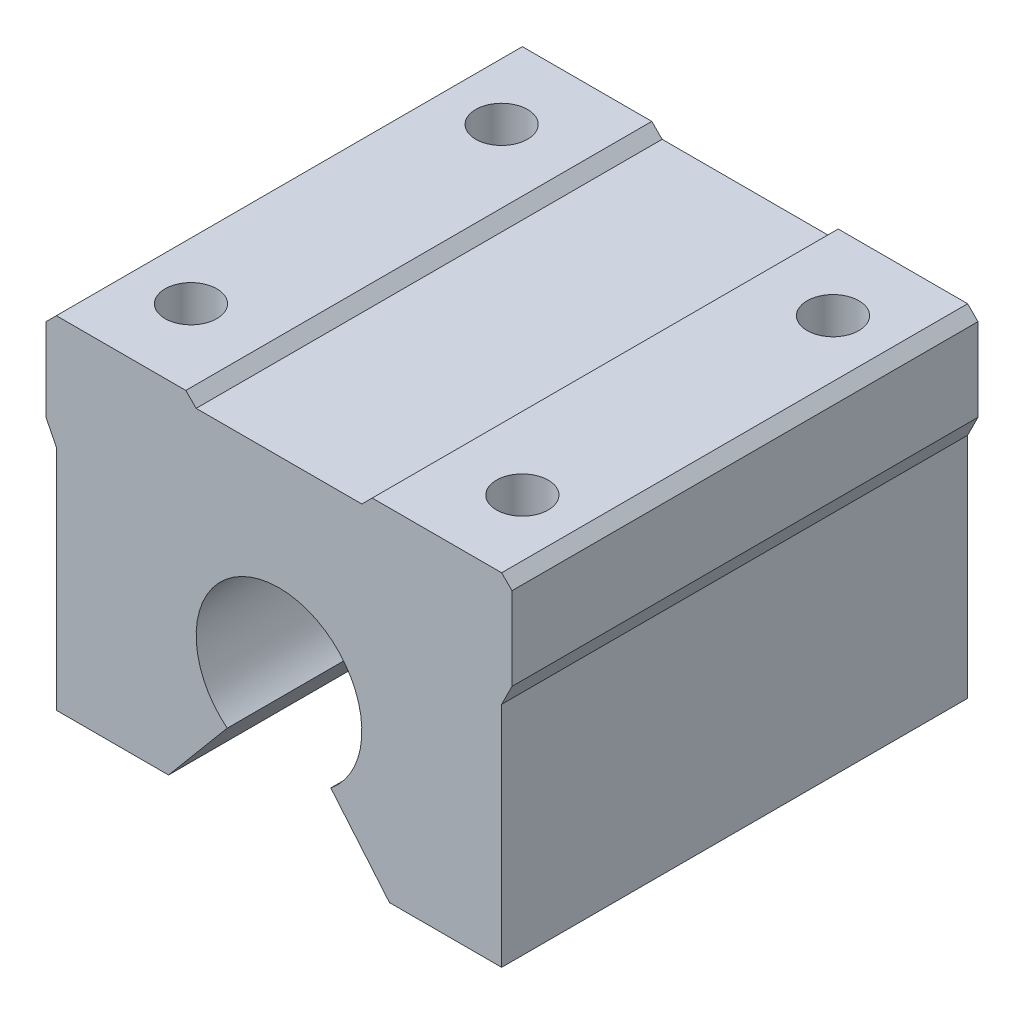
ISO-10303-21;
HEADER;
FILE_DESCRIPTION(('STEP AP214'),'2;1');
FILE_NAME('part.step','',(''),(''),'','','');
FILE_SCHEMA(('AUTOMOTIVE_DESIGN { 1 0 10303 214 1 1 1 1 }'));
ENDSEC;
DATA;
#1=APPLICATION_CONTEXT('core data for automotive mechanical design processes');
#2=APPLICATION_PROTOCOL_DEFINITION('international standard','automotive_design',2000,#1);
#3=PRODUCT_CONTEXT('',#1,'mechanical');
#4=PRODUCT('Part','Part','',(#3));
#5=PRODUCT_RELATED_PRODUCT_CATEGORY('part','',(#4));
#6=PRODUCT_DEFINITION_FORMATION('','',#4);
#7=PRODUCT_DEFINITION_CONTEXT('part definition',#1,'design');
#8=PRODUCT_DEFINITION('design','',#6,#7);
#9=PRODUCT_DEFINITION_SHAPE('','',#8);
#10=(LENGTH_UNIT() NAMED_UNIT(*) SI_UNIT(.MILLI.,.METRE.));
#11=(NAMED_UNIT(*) PLANE_ANGLE_UNIT() SI_UNIT($,.RADIAN.));
#12=(NAMED_UNIT(*) SI_UNIT($,.STERADIAN.) SOLID_ANGLE_UNIT());
#13=UNCERTAINTY_MEASURE_WITH_UNIT(LENGTH_MEASURE(1.E-05),#10,'distance_accuracy_value','');
#14=(GEOMETRIC_REPRESENTATION_CONTEXT(3) GLOBAL_UNCERTAINTY_ASSIGNED_CONTEXT((#13)) GLOBAL_UNIT_ASSIGNED_CONTEXT((#10,
#11,#12)) REPRESENTATION_CONTEXT('',''));
#15=CARTESIAN_POINT('',(0.,0.,0.));
#16=DIRECTION('',(0.,0.,1.));
#17=DIRECTION('',(1.,0.,0.));
#18=AXIS2_PLACEMENT_3D('',#15,#16,#17);
#19=CARTESIAN_POINT('',(0.,13.,45.));
#20=DIRECTION('',(0.,0.,-1.));
#21=DIRECTION('',(-1.,0.,0.));
#22=AXIS2_PLACEMENT_3D('',#19,#20,#21);
#23=CYLINDRICAL_SURFACE('',#22,8.);
#24=CARTESIAN_POINT('',(0.,13.,0.));
#25=DIRECTION('',(0.,0.,-1.));
#26=DIRECTION('',(1.,0.,0.));
#27=AXIS2_PLACEMENT_3D('',#24,#25,#26);
#28=CIRCLE('',#27,8.);
#29=CARTESIAN_POINT('',(-5.,6.7550020016016,0.));
#30=VERTEX_POINT('',#29);
#31=CARTESIAN_POINT('',(5.,6.7550020016016,0.));
#32=VERTEX_POINT('',#31);
#33=EDGE_CURVE('E193',#30,#32,#28,.T.);
#34=ORIENTED_EDGE('',*,*,#33,.T.);
#35=DIRECTION('',(0.,0.,-1.));
#36=VECTOR('',#35,1.);
#37=CARTESIAN_POINT('',(5.,6.7550020016016,45.));
#38=LINE('',#37,#36);
#39=CARTESIAN_POINT('',(5.,6.7550020016016,45.));
#40=VERTEX_POINT('',#39);
#41=EDGE_CURVE('E11',#40,#32,#38,.T.);
#42=ORIENTED_EDGE('',*,*,#41,.F.);
#43=CARTESIAN_POINT('',(0.,13.,45.));
#44=DIRECTION('',(0.,0.,-1.));
#45=DIRECTION('',(1.,0.,0.));
#46=AXIS2_PLACEMENT_3D('',#43,#44,#45);
#47=CIRCLE('',#46,8.);
#48=CARTESIAN_POINT('',(-5.,6.7550020016016,45.));
#49=VERTEX_POINT('',#48);
#50=EDGE_CURVE('E228',#49,#40,#47,.T.);
#51=ORIENTED_EDGE('',*,*,#50,.F.);
#52=DIRECTION('',(0.,0.,-1.));
#53=VECTOR('',#52,1.);
#54=CARTESIAN_POINT('',(-5.,6.7550020016016,45.));
#55=LINE('',#54,#53);
#56=EDGE_CURVE('E189',#49,#30,#55,.T.);
#57=ORIENTED_EDGE('',*,*,#56,.T.);
#58=EDGE_LOOP('',(#34,#42,#51,#57));
#59=FACE_BOUND('',#58,.T.);
#60=ADVANCED_FACE('F34',(#59),#23,.F.);
#61=CARTESIAN_POINT('',(10.6681196881457,0.,45.));
#62=DIRECTION('',(0.766044443118977,0.642787609686541,0.));
#63=DIRECTION('',(-0.642787609686541,0.766044443118977,0.));
#64=AXIS2_PLACEMENT_3D('',#61,#62,#63);
#65=PLANE('',#64);
#66=DIRECTION('',(0.642787609686541,-0.766044443118977,0.));
#67=VECTOR('',#66,1.);
#68=CARTESIAN_POINT('',(10.6681196881457,0.,0.));
#69=LINE('',#68,#67);
#70=CARTESIAN_POINT('',(10.6681196881457,0.,0.));
#71=VERTEX_POINT('',#70);
#72=EDGE_CURVE('E196',#32,#71,#69,.T.);
#73=ORIENTED_EDGE('',*,*,#72,.T.);
#74=DIRECTION('',(0.,0.,-1.));
#75=VECTOR('',#74,1.);
#76=CARTESIAN_POINT('',(10.6681196881457,0.,45.));
#77=LINE('',#76,#75);
#78=CARTESIAN_POINT('',(10.6681196881457,0.,45.));
#79=VERTEX_POINT('',#78);
#80=EDGE_CURVE('E42',#79,#71,#77,.T.);
#81=ORIENTED_EDGE('',*,*,#80,.F.);
#82=DIRECTION('',(0.642787609686541,-0.766044443118977,0.));
#83=VECTOR('',#82,1.);
#84=CARTESIAN_POINT('',(10.6681196881457,0.,45.));
#85=LINE('',#84,#83);
#86=EDGE_CURVE('E124',#40,#79,#85,.T.);
#87=ORIENTED_EDGE('',*,*,#86,.F.);
#88=ORIENTED_EDGE('',*,*,#41,.T.);
#89=EDGE_LOOP('',(#73,#81,#87,#88));
#90=FACE_BOUND('',#89,.T.);
#91=ADVANCED_FACE('F336',(#90),#65,.F.);
#92=CARTESIAN_POINT('',(21.5,0.,45.));
#93=DIRECTION('',(0.,1.,0.));
#94=DIRECTION('',(-1.,0.,0.));
#95=AXIS2_PLACEMENT_3D('',#92,#93,#94);
#96=PLANE('',#95);
#97=DIRECTION('',(1.,0.,0.));
#98=VECTOR('',#97,1.);
#99=CARTESIAN_POINT('',(21.5,0.,0.));
#100=LINE('',#99,#98);
#101=CARTESIAN_POINT('',(21.5,0.,0.));
#102=VERTEX_POINT('',#101);
#103=EDGE_CURVE('E199',#71,#102,#100,.T.);
#104=ORIENTED_EDGE('',*,*,#103,.T.);
#105=DIRECTION('',(0.,0.,-1.));
#106=VECTOR('',#105,1.);
#107=CARTESIAN_POINT('',(21.5,0.,45.));
#108=LINE('',#107,#106);
#109=CARTESIAN_POINT('',(21.5,0.,45.));
#110=VERTEX_POINT('',#109);
#111=EDGE_CURVE('E265',#110,#102,#108,.T.);
#112=ORIENTED_EDGE('',*,*,#111,.F.);
#113=DIRECTION('',(1.,0.,0.));
#114=VECTOR('',#113,1.);
#115=CARTESIAN_POINT('',(21.5,0.,45.));
#116=LINE('',#115,#114);
#117=EDGE_CURVE('E273',#79,#110,#116,.T.);
#118=ORIENTED_EDGE('',*,*,#117,.F.);
#119=ORIENTED_EDGE('',*,*,#80,.T.);
#120=EDGE_LOOP('',(#104,#112,#118,#119));
#121=FACE_BOUND('',#120,.T.);
#122=ADVANCED_FACE('F271',(#121),#96,.F.);
#123=CARTESIAN_POINT('',(21.5,22.,45.));
#124=DIRECTION('',(-1.,0.,0.));
#125=DIRECTION('',(0.,-1.,0.));
#126=AXIS2_PLACEMENT_3D('',#123,#124,#125);
#127=PLANE('',#126);
#128=DIRECTION('',(0.,1.,0.));
#129=VECTOR('',#128,1.);
#130=CARTESIAN_POINT('',(21.5,22.,0.));
#131=LINE('',#130,#129);
#132=CARTESIAN_POINT('',(21.5,22.,0.));
#133=VERTEX_POINT('',#132);
#134=EDGE_CURVE('E201',#102,#133,#131,.T.);
#135=ORIENTED_EDGE('',*,*,#134,.T.);
#136=DIRECTION('',(0.,0.,-1.));
#137=VECTOR('',#136,1.);
#138=CARTESIAN_POINT('',(21.5,22.,45.));
#139=LINE('',#138,#137);
#140=CARTESIAN_POINT('',(21.5,22.,45.));
#141=VERTEX_POINT('',#140);
#142=EDGE_CURVE('E262',#141,#133,#139,.T.);
#143=ORIENTED_EDGE('',*,*,#142,.F.);
#144=DIRECTION('',(0.,1.,0.));
#145=VECTOR('',#144,1.);
#146=CARTESIAN_POINT('',(21.5,22.,45.));
#147=LINE('',#146,#145);
#148=EDGE_CURVE('E291',#110,#141,#147,.T.);
#149=ORIENTED_EDGE('',*,*,#148,.F.);
#150=ORIENTED_EDGE('',*,*,#111,.T.);
#151=EDGE_LOOP('',(#135,#143,#149,#150));
#152=FACE_BOUND('',#151,.T.);
#153=ADVANCED_FACE('F282',(#152),#127,.F.);
#154=CARTESIAN_POINT('',(22.5,24.,45.));
#155=DIRECTION('',(-0.894427190999916,0.447213595499958,0.));
#156=DIRECTION('',(-0.447213595499958,-0.894427190999916,0.));
#157=AXIS2_PLACEMENT_3D('',#154,#155,#156);
#158=PLANE('',#157);
#159=DIRECTION('',(0.447213595499958,0.894427190999916,0.));
#160=VECTOR('',#159,1.);
#161=CARTESIAN_POINT('',(22.5,24.,0.));
#162=LINE('',#161,#160);
#163=CARTESIAN_POINT('',(22.5,24.,0.));
#164=VERTEX_POINT('',#163);
#165=EDGE_CURVE('E203',#133,#164,#162,.T.);
#166=ORIENTED_EDGE('',*,*,#165,.T.);
#167=DIRECTION('',(0.,0.,-1.));
#168=VECTOR('',#167,1.);
#169=CARTESIAN_POINT('',(22.5,24.,45.));
#170=LINE('',#169,#168);
#171=CARTESIAN_POINT('',(22.5,24.,45.));
#172=VERTEX_POINT('',#171);
#173=EDGE_CURVE('E259',#172,#164,#170,.T.);
#174=ORIENTED_EDGE('',*,*,#173,.F.);
#175=DIRECTION('',(0.447213595499958,0.894427190999916,0.));
#176=VECTOR('',#175,1.);
#177=CARTESIAN_POINT('',(22.5,24.,45.));
#178=LINE('',#177,#176);
#179=EDGE_CURVE('E288',#141,#172,#178,.T.);
#180=ORIENTED_EDGE('',*,*,#179,.F.);
#181=ORIENTED_EDGE('',*,*,#142,.T.);
#182=EDGE_LOOP('',(#166,#174,#180,#181));
#183=FACE_BOUND('',#182,.T.);
#184=ADVANCED_FACE('F286',(#183),#158,.F.);
#185=CARTESIAN_POINT('',(22.5,32.,45.));
#186=DIRECTION('',(-1.,0.,0.));
#187=DIRECTION('',(0.,0.,1.));
#188=AXIS2_PLACEMENT_3D('',#185,#186,#187);
#189=PLANE('',#188);
#190=DIRECTION('',(0.,1.,0.));
#191=VECTOR('',#190,1.);
#192=CARTESIAN_POINT('',(22.5,32.,0.));
#193=LINE('',#192,#191);
#194=CARTESIAN_POINT('',(22.5,32.,0.));
#195=VERTEX_POINT('',#194);
#196=EDGE_CURVE('E205',#164,#195,#193,.T.);
#197=ORIENTED_EDGE('',*,*,#196,.T.);
#198=DIRECTION('',(0.,0.,-1.));
#199=VECTOR('',#198,1.);
#200=CARTESIAN_POINT('',(22.5,32.,45.));
#201=LINE('',#200,#199);
#202=CARTESIAN_POINT('',(22.5,32.,45.));
#203=VERTEX_POINT('',#202);
#204=EDGE_CURVE('E256',#203,#195,#201,.T.);
#205=ORIENTED_EDGE('',*,*,#204,.F.);
#206=DIRECTION('',(0.,1.,0.));
#207=VECTOR('',#206,1.);
#208=CARTESIAN_POINT('',(22.5,32.,45.));
#209=LINE('',#208,#207);
#210=EDGE_CURVE('E290',#172,#203,#209,.T.);
#211=ORIENTED_EDGE('',*,*,#210,.F.);
#212=ORIENTED_EDGE('',*,*,#173,.T.);
#213=EDGE_LOOP('',(#197,#205,#211,#212));
#214=FACE_BOUND('',#213,.T.);
#215=ADVANCED_FACE('F349',(#214),#189,.F.);
#216=CARTESIAN_POINT('',(21.5,33.,45.));
#217=DIRECTION('',(-0.707106781186547,-0.707106781186547,0.));
#218=DIRECTION('',(0.707106781186548,-0.707106781186548,0.));
#219=AXIS2_PLACEMENT_3D('',#216,#217,#218);
#220=PLANE('',#219);
#221=DIRECTION('',(-0.707106781186547,0.707106781186547,0.));
#222=VECTOR('',#221,1.);
#223=CARTESIAN_POINT('',(21.5,33.,0.));
#224=LINE('',#223,#222);
#225=CARTESIAN_POINT('',(21.5,33.,0.));
#226=VERTEX_POINT('',#225);
#227=EDGE_CURVE('E207',#195,#226,#224,.T.);
#228=ORIENTED_EDGE('',*,*,#227,.T.);
#229=DIRECTION('',(0.,0.,-1.));
#230=VECTOR('',#229,1.);
#231=CARTESIAN_POINT('',(21.5,33.,45.));
#232=LINE('',#231,#230);
#233=CARTESIAN_POINT('',(21.5,33.,45.));
#234=VERTEX_POINT('',#233);
#235=EDGE_CURVE('E253',#234,#226,#232,.T.);
#236=ORIENTED_EDGE('',*,*,#235,.F.);
#237=DIRECTION('',(-0.707106781186547,0.707106781186547,0.));
#238=VECTOR('',#237,1.);
#239=CARTESIAN_POINT('',(21.5,33.,45.));
#240=LINE('',#239,#238);
#241=EDGE_CURVE('E293',#203,#234,#240,.T.);
#242=ORIENTED_EDGE('',*,*,#241,.F.);
#243=ORIENTED_EDGE('',*,*,#204,.T.);
#244=EDGE_LOOP('',(#228,#236,#242,#243));
#245=FACE_BOUND('',#244,.T.);
#246=ADVANCED_FACE('F352',(#245),#220,.F.);
#247=CARTESIAN_POINT('',(9.,33.,45.));
#248=DIRECTION('',(0.,-1.,0.));
#249=DIRECTION('',(0.,0.,-1.));
#250=AXIS2_PLACEMENT_3D('',#247,#248,#249);
#251=PLANE('',#250);
#252=CARTESIAN_POINT('',(16.,33.,37.5));
#253=DIRECTION('',(0.,1.,0.));
#254=DIRECTION('',(0.,0.,1.));
#255=AXIS2_PLACEMENT_3D('',#252,#253,#254);
#256=CIRCLE('',#255,2.5);
#257=CARTESIAN_POINT('',(16.,33.,40.));
#258=VERTEX_POINT('',#257);
#259=EDGE_CURVE('E528',#258,#258,#256,.T.);
#260=ORIENTED_EDGE('',*,*,#259,.F.);
#261=EDGE_LOOP('',(#260));
#262=FACE_BOUND('',#261,.T.);
#263=CARTESIAN_POINT('',(16.,33.,7.5));
#264=DIRECTION('',(0.,1.,0.));
#265=DIRECTION('',(0.,0.,1.));
#266=AXIS2_PLACEMENT_3D('',#263,#264,#265);
#267=CIRCLE('',#266,2.5);
#268=CARTESIAN_POINT('',(16.,33.,10.));
#269=VERTEX_POINT('',#268);
#270=EDGE_CURVE('E531',#269,#269,#267,.T.);
#271=ORIENTED_EDGE('',*,*,#270,.F.);
#272=EDGE_LOOP('',(#271));
#273=FACE_BOUND('',#272,.T.);
#274=DIRECTION('',(-1.,0.,0.));
#275=VECTOR('',#274,1.);
#276=CARTESIAN_POINT('',(9.,33.,0.));
#277=LINE('',#276,#275);
#278=CARTESIAN_POINT('',(9.,33.,0.));
#279=VERTEX_POINT('',#278);
#280=EDGE_CURVE('E209',#226,#279,#277,.T.);
#281=ORIENTED_EDGE('',*,*,#280,.T.);
#282=DIRECTION('',(0.,0.,-1.));
#283=VECTOR('',#282,1.);
#284=CARTESIAN_POINT('',(9.,33.,45.));
#285=LINE('',#284,#283);
#286=CARTESIAN_POINT('',(9.,33.,45.));
#287=VERTEX_POINT('',#286);
#288=EDGE_CURVE('E250',#287,#279,#285,.T.);
#289=ORIENTED_EDGE('',*,*,#288,.F.);
#290=DIRECTION('',(-1.,0.,0.));
#291=VECTOR('',#290,1.);
#292=CARTESIAN_POINT('',(9.,33.,45.));
#293=LINE('',#292,#291);
#294=EDGE_CURVE('E299',#234,#287,#293,.T.);
#295=ORIENTED_EDGE('',*,*,#294,.F.);
#296=ORIENTED_EDGE('',*,*,#235,.T.);
#297=EDGE_LOOP('',(#281,#289,#295,#296));
#298=FACE_BOUND('',#297,.T.);
#299=ADVANCED_FACE('F356',(#262,#273,#298),#251,.F.);
#300=CARTESIAN_POINT('',(8.,32.,45.));
#301=DIRECTION('',(0.707106781186547,-0.707106781186547,0.));
#302=DIRECTION('',(0.707106781186548,0.707106781186548,0.));
#303=AXIS2_PLACEMENT_3D('',#300,#301,#302);
#304=PLANE('',#303);
#305=DIRECTION('',(-0.707106781186547,-0.707106781186547,0.));
#306=VECTOR('',#305,1.);
#307=CARTESIAN_POINT('',(8.,32.,0.));
#308=LINE('',#307,#306);
#309=CARTESIAN_POINT('',(8.,32.,0.));
#310=VERTEX_POINT('',#309);
#311=EDGE_CURVE('E211',#279,#310,#308,.T.);
#312=ORIENTED_EDGE('',*,*,#311,.T.);
#313=DIRECTION('',(0.,0.,-1.));
#314=VECTOR('',#313,1.);
#315=CARTESIAN_POINT('',(8.,32.,45.));
#316=LINE('',#315,#314);
#317=CARTESIAN_POINT('',(8.,32.,45.));
#318=VERTEX_POINT('',#317);
#319=EDGE_CURVE('E247',#318,#310,#316,.T.);
#320=ORIENTED_EDGE('',*,*,#319,.F.);
#321=DIRECTION('',(-0.707106781186547,-0.707106781186547,0.));
#322=VECTOR('',#321,1.);
#323=CARTESIAN_POINT('',(8.,32.,45.));
#324=LINE('',#323,#322);
#325=EDGE_CURVE('E301',#287,#318,#324,.T.);
#326=ORIENTED_EDGE('',*,*,#325,.F.);
#327=ORIENTED_EDGE('',*,*,#288,.T.);
#328=EDGE_LOOP('',(#312,#320,#326,#327));
#329=FACE_BOUND('',#328,.T.);
#330=ADVANCED_FACE('F360',(#329),#304,.F.);
#331=CARTESIAN_POINT('',(8.,32.,45.));
#332=DIRECTION('',(0.,-1.,0.));
#333=DIRECTION('',(0.,0.,-1.));
#334=AXIS2_PLACEMENT_3D('',#331,#332,#333);
#335=PLANE('',#334);
#336=DIRECTION('',(-1.,0.,0.));
#337=VECTOR('',#336,1.);
#338=CARTESIAN_POINT('',(8.,32.,0.));
#339=LINE('',#338,#337);
#340=CARTESIAN_POINT('',(-8.,32.,0.));
#341=VERTEX_POINT('',#340);
#342=EDGE_CURVE('E213',#310,#341,#339,.T.);
#343=ORIENTED_EDGE('',*,*,#342,.T.);
#344=DIRECTION('',(0.,0.,-1.));
#345=VECTOR('',#344,1.);
#346=CARTESIAN_POINT('',(-8.,32.,45.));
#347=LINE('',#346,#345);
#348=CARTESIAN_POINT('',(-8.,32.,45.));
#349=VERTEX_POINT('',#348);
#350=EDGE_CURVE('E244',#349,#341,#347,.T.);
#351=ORIENTED_EDGE('',*,*,#350,.F.);
#352=DIRECTION('',(-1.,0.,0.));
#353=VECTOR('',#352,1.);
#354=CARTESIAN_POINT('',(8.,32.,45.));
#355=LINE('',#354,#353);
#356=EDGE_CURVE('E303',#318,#349,#355,.T.);
#357=ORIENTED_EDGE('',*,*,#356,.F.);
#358=ORIENTED_EDGE('',*,*,#319,.T.);
#359=EDGE_LOOP('',(#343,#351,#357,#358));
#360=FACE_BOUND('',#359,.T.);
#361=ADVANCED_FACE('F364',(#360),#335,.F.);
#362=CARTESIAN_POINT('',(-8.,32.,45.));
#363=DIRECTION('',(-0.707106781186547,-0.707106781186547,0.));
#364=DIRECTION('',(0.707106781186548,-0.707106781186548,0.));
#365=AXIS2_PLACEMENT_3D('',#362,#363,#364);
#366=PLANE('',#365);
#367=DIRECTION('',(-0.707106781186547,0.707106781186547,0.));
#368=VECTOR('',#367,1.);
#369=CARTESIAN_POINT('',(-8.,32.,0.));
#370=LINE('',#369,#368);
#371=CARTESIAN_POINT('',(-9.,33.,0.));
#372=VERTEX_POINT('',#371);
#373=EDGE_CURVE('E215',#341,#372,#370,.T.);
#374=ORIENTED_EDGE('',*,*,#373,.T.);
#375=DIRECTION('',(0.,0.,-1.));
#376=VECTOR('',#375,1.);
#377=CARTESIAN_POINT('',(-9.,33.,45.));
#378=LINE('',#377,#376);
#379=CARTESIAN_POINT('',(-9.,33.,45.));
#380=VERTEX_POINT('',#379);
#381=EDGE_CURVE('E241',#380,#372,#378,.T.);
#382=ORIENTED_EDGE('',*,*,#381,.F.);
#383=DIRECTION('',(-0.707106781186547,0.707106781186547,0.));
#384=VECTOR('',#383,1.);
#385=CARTESIAN_POINT('',(-8.,32.,45.));
#386=LINE('',#385,#384);
#387=EDGE_CURVE('E305',#349,#380,#386,.T.);
#388=ORIENTED_EDGE('',*,*,#387,.F.);
#389=ORIENTED_EDGE('',*,*,#350,.T.);
#390=EDGE_LOOP('',(#374,#382,#388,#389));
#391=FACE_BOUND('',#390,.T.);
#392=ADVANCED_FACE('F368',(#391),#366,.F.);
#393=CARTESIAN_POINT('',(-9.,33.,45.));
#394=DIRECTION('',(0.,-1.,0.));
#395=DIRECTION('',(0.,0.,-1.));
#396=AXIS2_PLACEMENT_3D('',#393,#394,#395);
#397=PLANE('',#396);
#398=CARTESIAN_POINT('',(-16.,33.,7.5));
#399=DIRECTION('',(0.,1.,0.));
#400=DIRECTION('',(0.,0.,1.));
#401=AXIS2_PLACEMENT_3D('',#398,#399,#400);
#402=CIRCLE('',#401,2.5);
#403=CARTESIAN_POINT('',(-16.,33.,10.));
#404=VERTEX_POINT('',#403);
#405=EDGE_CURVE('E534',#404,#404,#402,.T.);
#406=ORIENTED_EDGE('',*,*,#405,.F.);
#407=EDGE_LOOP('',(#406));
#408=FACE_BOUND('',#407,.T.);
#409=CARTESIAN_POINT('',(-16.,33.,37.5));
#410=DIRECTION('',(0.,1.,0.));
#411=DIRECTION('',(0.,0.,1.));
#412=AXIS2_PLACEMENT_3D('',#409,#410,#411);
#413=CIRCLE('',#412,2.5);
#414=CARTESIAN_POINT('',(-16.,33.,40.));
#415=VERTEX_POINT('',#414);
#416=EDGE_CURVE('E197',#415,#415,#413,.T.);
#417=ORIENTED_EDGE('',*,*,#416,.F.);
#418=EDGE_LOOP('',(#417));
#419=FACE_BOUND('',#418,.T.);
#420=DIRECTION('',(-1.,0.,0.));
#421=VECTOR('',#420,1.);
#422=CARTESIAN_POINT('',(-9.,33.,0.));
#423=LINE('',#422,#421);
#424=CARTESIAN_POINT('',(-21.5,33.,0.));
#425=VERTEX_POINT('',#424);
#426=EDGE_CURVE('E217',#372,#425,#423,.T.);
#427=ORIENTED_EDGE('',*,*,#426,.T.);
#428=DIRECTION('',(0.,0.,-1.));
#429=VECTOR('',#428,1.);
#430=CARTESIAN_POINT('',(-21.5,33.,45.));
#431=LINE('',#430,#429);
#432=CARTESIAN_POINT('',(-21.5,33.,45.));
#433=VERTEX_POINT('',#432);
#434=EDGE_CURVE('E238',#433,#425,#431,.T.);
#435=ORIENTED_EDGE('',*,*,#434,.F.);
#436=DIRECTION('',(-1.,0.,0.));
#437=VECTOR('',#436,1.);
#438=CARTESIAN_POINT('',(-9.,33.,45.));
#439=LINE('',#438,#437);
#440=EDGE_CURVE('E307',#380,#433,#439,.T.);
#441=ORIENTED_EDGE('',*,*,#440,.F.);
#442=ORIENTED_EDGE('',*,*,#381,.T.);
#443=EDGE_LOOP('',(#427,#435,#441,#442));
#444=FACE_BOUND('',#443,.T.);
#445=ADVANCED_FACE('F372',(#408,#419,#444),#397,.F.);
#446=CARTESIAN_POINT('',(-21.5,33.,45.));
#447=DIRECTION('',(0.707106781186547,-0.707106781186547,0.));
#448=DIRECTION('',(0.707106781186548,0.707106781186548,0.));
#449=AXIS2_PLACEMENT_3D('',#446,#447,#448);
#450=PLANE('',#449);
#451=DIRECTION('',(-0.707106781186547,-0.707106781186547,0.));
#452=VECTOR('',#451,1.);
#453=CARTESIAN_POINT('',(-21.5,33.,0.));
#454=LINE('',#453,#452);
#455=CARTESIAN_POINT('',(-22.5,32.,0.));
#456=VERTEX_POINT('',#455);
#457=EDGE_CURVE('E219',#425,#456,#454,.T.);
#458=ORIENTED_EDGE('',*,*,#457,.T.);
#459=DIRECTION('',(0.,0.,-1.));
#460=VECTOR('',#459,1.);
#461=CARTESIAN_POINT('',(-22.5,32.,45.));
#462=LINE('',#461,#460);
#463=CARTESIAN_POINT('',(-22.5,32.,45.));
#464=VERTEX_POINT('',#463);
#465=EDGE_CURVE('E235',#464,#456,#462,.T.);
#466=ORIENTED_EDGE('',*,*,#465,.F.);
#467=DIRECTION('',(-0.707106781186547,-0.707106781186547,0.));
#468=VECTOR('',#467,1.);
#469=CARTESIAN_POINT('',(-21.5,33.,45.));
#470=LINE('',#469,#468);
#471=EDGE_CURVE('E309',#433,#464,#470,.T.);
#472=ORIENTED_EDGE('',*,*,#471,.F.);
#473=ORIENTED_EDGE('',*,*,#434,.T.);
#474=EDGE_LOOP('',(#458,#466,#472,#473));
#475=FACE_BOUND('',#474,.T.);
#476=ADVANCED_FACE('F376',(#475),#450,.F.);
#477=CARTESIAN_POINT('',(-22.5,32.,45.));
#478=DIRECTION('',(1.,0.,0.));
#479=DIRECTION('',(0.,0.,-1.));
#480=AXIS2_PLACEMENT_3D('',#477,#478,#479);
#481=PLANE('',#480);
#482=DIRECTION('',(0.,-1.,0.));
#483=VECTOR('',#482,1.);
#484=CARTESIAN_POINT('',(-22.5,32.,0.));
#485=LINE('',#484,#483);
#486=CARTESIAN_POINT('',(-22.5,24.,0.));
#487=VERTEX_POINT('',#486);
#488=EDGE_CURVE('E221',#456,#487,#485,.T.);
#489=ORIENTED_EDGE('',*,*,#488,.T.);
#490=DIRECTION('',(0.,0.,-1.));
#491=VECTOR('',#490,1.);
#492=CARTESIAN_POINT('',(-22.5,24.,45.));
#493=LINE('',#492,#491);
#494=CARTESIAN_POINT('',(-22.5,24.,45.));
#495=VERTEX_POINT('',#494);
#496=EDGE_CURVE('E232',#495,#487,#493,.T.);
#497=ORIENTED_EDGE('',*,*,#496,.F.);
#498=DIRECTION('',(0.,-1.,0.));
#499=VECTOR('',#498,1.);
#500=CARTESIAN_POINT('',(-22.5,32.,45.));
#501=LINE('',#500,#499);
#502=EDGE_CURVE('E311',#464,#495,#501,.T.);
#503=ORIENTED_EDGE('',*,*,#502,.F.);
#504=ORIENTED_EDGE('',*,*,#465,.T.);
#505=EDGE_LOOP('',(#489,#497,#503,#504));
#506=FACE_BOUND('',#505,.T.);
#507=ADVANCED_FACE('F317',(#506),#481,.F.);
#508=CARTESIAN_POINT('',(-22.5,24.,45.));
#509=DIRECTION('',(0.894427190999916,0.447213595499958,0.));
#510=DIRECTION('',(-0.447213595499958,0.894427190999916,0.));
#511=AXIS2_PLACEMENT_3D('',#508,#509,#510);
#512=PLANE('',#511);
#513=DIRECTION('',(0.447213595499958,-0.894427190999916,0.));
#514=VECTOR('',#513,1.);
#515=CARTESIAN_POINT('',(-22.5,24.,0.));
#516=LINE('',#515,#514);
#517=CARTESIAN_POINT('',(-21.5,22.,0.));
#518=VERTEX_POINT('',#517);
#519=EDGE_CURVE('E223',#487,#518,#516,.T.);
#520=ORIENTED_EDGE('',*,*,#519,.T.);
#521=DIRECTION('',(0.,0.,-1.));
#522=VECTOR('',#521,1.);
#523=CARTESIAN_POINT('',(-21.5,22.,45.));
#524=LINE('',#523,#522);
#525=CARTESIAN_POINT('',(-21.5,22.,45.));
#526=VERTEX_POINT('',#525);
#527=EDGE_CURVE('E184',#526,#518,#524,.T.);
#528=ORIENTED_EDGE('',*,*,#527,.F.);
#529=DIRECTION('',(0.447213595499958,-0.894427190999916,0.));
#530=VECTOR('',#529,1.);
#531=CARTESIAN_POINT('',(-22.5,24.,45.));
#532=LINE('',#531,#530);
#533=EDGE_CURVE('E175',#495,#526,#532,.T.);
#534=ORIENTED_EDGE('',*,*,#533,.F.);
#535=ORIENTED_EDGE('',*,*,#496,.T.);
#536=EDGE_LOOP('',(#520,#528,#534,#535));
#537=FACE_BOUND('',#536,.T.);
#538=ADVANCED_FACE('F321',(#537),#512,.F.);
#539=CARTESIAN_POINT('',(-21.5,22.,45.));
#540=DIRECTION('',(1.,0.,0.));
#541=DIRECTION('',(0.,1.,0.));
#542=AXIS2_PLACEMENT_3D('',#539,#540,#541);
#543=PLANE('',#542);
#544=DIRECTION('',(0.,-1.,0.));
#545=VECTOR('',#544,1.);
#546=CARTESIAN_POINT('',(-21.5,22.,0.));
#547=LINE('',#546,#545);
#548=CARTESIAN_POINT('',(-21.5,0.,0.));
#549=VERTEX_POINT('',#548);
#550=EDGE_CURVE('E183',#518,#549,#547,.T.);
#551=ORIENTED_EDGE('',*,*,#550,.T.);
#552=DIRECTION('',(0.,0.,-1.));
#553=VECTOR('',#552,1.);
#554=CARTESIAN_POINT('',(-21.5,0.,45.));
#555=LINE('',#554,#553);
#556=CARTESIAN_POINT('',(-21.5,0.,45.));
#557=VERTEX_POINT('',#556);
#558=EDGE_CURVE('E180',#557,#549,#555,.T.);
#559=ORIENTED_EDGE('',*,*,#558,.F.);
#560=DIRECTION('',(0.,-1.,0.));
#561=VECTOR('',#560,1.);
#562=CARTESIAN_POINT('',(-21.5,22.,45.));
#563=LINE('',#562,#561);
#564=EDGE_CURVE('E169',#526,#557,#563,.T.);
#565=ORIENTED_EDGE('',*,*,#564,.F.);
#566=ORIENTED_EDGE('',*,*,#527,.T.);
#567=EDGE_LOOP('',(#551,#559,#565,#566));
#568=FACE_BOUND('',#567,.T.);
#569=ADVANCED_FACE('F181',(#568),#543,.F.);
#570=CARTESIAN_POINT('',(-21.5,0.,45.));
#571=DIRECTION('',(0.,1.,0.));
#572=DIRECTION('',(-1.,0.,0.));
#573=AXIS2_PLACEMENT_3D('',#570,#571,#572);
#574=PLANE('',#573);
#575=DIRECTION('',(1.,0.,0.));
#576=VECTOR('',#575,1.);
#577=CARTESIAN_POINT('',(-21.5,0.,0.));
#578=LINE('',#577,#576);
#579=CARTESIAN_POINT('',(-10.6681196881457,0.,0.));
#580=VERTEX_POINT('',#579);
#581=EDGE_CURVE('E110',#549,#580,#578,.T.);
#582=ORIENTED_EDGE('',*,*,#581,.T.);
#583=DIRECTION('',(0.,0.,-1.));
#584=VECTOR('',#583,1.);
#585=CARTESIAN_POINT('',(-10.6681196881457,0.,45.));
#586=LINE('',#585,#584);
#587=CARTESIAN_POINT('',(-10.6681196881457,0.,45.));
#588=VERTEX_POINT('',#587);
#589=EDGE_CURVE('E185',#588,#580,#586,.T.);
#590=ORIENTED_EDGE('',*,*,#589,.F.);
#591=DIRECTION('',(1.,0.,0.));
#592=VECTOR('',#591,1.);
#593=CARTESIAN_POINT('',(-21.5,0.,45.));
#594=LINE('',#593,#592);
#595=EDGE_CURVE('E173',#557,#588,#594,.T.);
#596=ORIENTED_EDGE('',*,*,#595,.F.);
#597=ORIENTED_EDGE('',*,*,#558,.T.);
#598=EDGE_LOOP('',(#582,#590,#596,#597));
#599=FACE_BOUND('',#598,.T.);
#600=ADVANCED_FACE('F187',(#599),#574,.F.);
#601=CARTESIAN_POINT('',(-10.6681196881457,0.,45.));
#602=DIRECTION('',(-0.766044443118977,0.642787609686541,0.));
#603=DIRECTION('',(-0.642787609686541,-0.766044443118977,0.));
#604=AXIS2_PLACEMENT_3D('',#601,#602,#603);
#605=PLANE('',#604);
#606=DIRECTION('',(0.642787609686541,0.766044443118977,0.));
#607=VECTOR('',#606,1.);
#608=CARTESIAN_POINT('',(-10.6681196881457,0.,0.));
#609=LINE('',#608,#607);
#610=EDGE_CURVE('E116',#580,#30,#609,.T.);
#611=ORIENTED_EDGE('',*,*,#610,.T.);
#612=ORIENTED_EDGE('',*,*,#56,.F.);
#613=DIRECTION('',(0.642787609686541,0.766044443118977,0.));
#614=VECTOR('',#613,1.);
#615=CARTESIAN_POINT('',(-10.6681196881457,0.,45.));
#616=LINE('',#615,#614);
#617=EDGE_CURVE('E50',#588,#49,#616,.T.);
#618=ORIENTED_EDGE('',*,*,#617,.F.);
#619=ORIENTED_EDGE('',*,*,#589,.T.);
#620=EDGE_LOOP('',(#611,#612,#618,#619));
#621=FACE_BOUND('',#620,.T.);
#622=ADVANCED_FACE('F325',(#621),#605,.F.);
#623=CARTESIAN_POINT('',(0.,13.,45.));
#624=DIRECTION('',(0.,0.,1.));
#625=DIRECTION('',(1.,0.,0.));
#626=AXIS2_PLACEMENT_3D('',#623,#624,#625);
#627=PLANE('',#626);
#628=ORIENTED_EDGE('',*,*,#50,.T.);
#629=ORIENTED_EDGE('',*,*,#86,.T.);
#630=ORIENTED_EDGE('',*,*,#117,.T.);
#631=ORIENTED_EDGE('',*,*,#148,.T.);
#632=ORIENTED_EDGE('',*,*,#179,.T.);
#633=ORIENTED_EDGE('',*,*,#210,.T.);
#634=ORIENTED_EDGE('',*,*,#241,.T.);
#635=ORIENTED_EDGE('',*,*,#294,.T.);
#636=ORIENTED_EDGE('',*,*,#325,.T.);
#637=ORIENTED_EDGE('',*,*,#356,.T.);
#638=ORIENTED_EDGE('',*,*,#387,.T.);
#639=ORIENTED_EDGE('',*,*,#440,.T.);
#640=ORIENTED_EDGE('',*,*,#471,.T.);
#641=ORIENTED_EDGE('',*,*,#502,.T.);
#642=ORIENTED_EDGE('',*,*,#533,.T.);
#643=ORIENTED_EDGE('',*,*,#564,.T.);
#644=ORIENTED_EDGE('',*,*,#595,.T.);
#645=ORIENTED_EDGE('',*,*,#617,.T.);
#646=EDGE_LOOP('',(#628,#629,#630,#631,#632,#633,#634,#635,#636,#637,#638,#639,#640,#641,#642,
#643,#644,#645));
#647=FACE_BOUND('',#646,.T.);
#648=ADVANCED_FACE('F171',(#647),#627,.T.);
#649=CARTESIAN_POINT('',(0.,13.,0.));
#650=DIRECTION('',(0.,0.,1.));
#651=DIRECTION('',(1.,0.,0.));
#652=AXIS2_PLACEMENT_3D('',#649,#650,#651);
#653=PLANE('',#652);
#654=ORIENTED_EDGE('',*,*,#33,.F.);
#655=ORIENTED_EDGE('',*,*,#610,.F.);
#656=ORIENTED_EDGE('',*,*,#581,.F.);
#657=ORIENTED_EDGE('',*,*,#550,.F.);
#658=ORIENTED_EDGE('',*,*,#519,.F.);
#659=ORIENTED_EDGE('',*,*,#488,.F.);
#660=ORIENTED_EDGE('',*,*,#457,.F.);
#661=ORIENTED_EDGE('',*,*,#426,.F.);
#662=ORIENTED_EDGE('',*,*,#373,.F.);
#663=ORIENTED_EDGE('',*,*,#342,.F.);
#664=ORIENTED_EDGE('',*,*,#311,.F.);
#665=ORIENTED_EDGE('',*,*,#280,.F.);
#666=ORIENTED_EDGE('',*,*,#227,.F.);
#667=ORIENTED_EDGE('',*,*,#196,.F.);
#668=ORIENTED_EDGE('',*,*,#165,.F.);
#669=ORIENTED_EDGE('',*,*,#134,.F.);
#670=ORIENTED_EDGE('',*,*,#103,.F.);
#671=ORIENTED_EDGE('',*,*,#72,.F.);
#672=EDGE_LOOP('',(#654,#655,#656,#657,#658,#659,#660,#661,#662,#663,#664,#665,#666,#667,#668,
#669,#670,#671));
#673=FACE_BOUND('',#672,.T.);
#674=ADVANCED_FACE('F277',(#673),#653,.F.);
#675=CARTESIAN_POINT('',(-16.,21.,37.5));
#676=DIRECTION('',(0.,1.,0.));
#677=DIRECTION('',(0.,0.,1.));
#678=AXIS2_PLACEMENT_3D('',#675,#676,#677);
#679=CYLINDRICAL_SURFACE('',#678,2.5);
#680=CARTESIAN_POINT('',(-16.,21.,37.5));
#681=DIRECTION('',(0.,1.,0.));
#682=DIRECTION('',(0.,0.,1.));
#683=AXIS2_PLACEMENT_3D('',#680,#681,#682);
#684=CIRCLE('',#683,2.5);
#685=CARTESIAN_POINT('',(-16.,21.,40.));
#686=VERTEX_POINT('',#685);
#687=EDGE_CURVE('E517',#686,#686,#684,.T.);
#688=ORIENTED_EDGE('',*,*,#687,.F.);
#689=EDGE_LOOP('',(#688));
#690=FACE_BOUND('',#689,.T.);
#691=ORIENTED_EDGE('',*,*,#416,.T.);
#692=EDGE_LOOP('',(#691));
#693=FACE_BOUND('',#692,.T.);
#694=ADVANCED_FACE('F413',(#690,#693),#679,.F.);
#695=CARTESIAN_POINT('',(-16.,21.,7.5));
#696=DIRECTION('',(0.,1.,0.));
#697=DIRECTION('',(0.,0.,1.));
#698=AXIS2_PLACEMENT_3D('',#695,#696,#697);
#699=CYLINDRICAL_SURFACE('',#698,2.5);
#700=CARTESIAN_POINT('',(-16.,21.,7.5));
#701=DIRECTION('',(0.,1.,0.));
#702=DIRECTION('',(0.,0.,1.));
#703=AXIS2_PLACEMENT_3D('',#700,#701,#702);
#704=CIRCLE('',#703,2.5);
#705=CARTESIAN_POINT('',(-16.,21.,10.));
#706=VERTEX_POINT('',#705);
#707=EDGE_CURVE('E520',#706,#706,#704,.T.);
#708=ORIENTED_EDGE('',*,*,#707,.F.);
#709=EDGE_LOOP('',(#708));
#710=FACE_BOUND('',#709,.T.);
#711=ORIENTED_EDGE('',*,*,#405,.T.);
#712=EDGE_LOOP('',(#711));
#713=FACE_BOUND('',#712,.T.);
#714=ADVANCED_FACE('F437',(#710,#713),#699,.F.);
#715=CARTESIAN_POINT('',(16.,21.,7.5));
#716=DIRECTION('',(0.,1.,0.));
#717=DIRECTION('',(0.,0.,1.));
#718=AXIS2_PLACEMENT_3D('',#715,#716,#717);
#719=CYLINDRICAL_SURFACE('',#718,2.5);
#720=CARTESIAN_POINT('',(16.,21.,7.5));
#721=DIRECTION('',(0.,1.,0.));
#722=DIRECTION('',(0.,0.,1.));
#723=AXIS2_PLACEMENT_3D('',#720,#721,#722);
#724=CIRCLE('',#723,2.5);
#725=CARTESIAN_POINT('',(16.,21.,10.));
#726=VERTEX_POINT('',#725);
#727=EDGE_CURVE('E525',#726,#726,#724,.T.);
#728=ORIENTED_EDGE('',*,*,#727,.F.);
#729=EDGE_LOOP('',(#728));
#730=FACE_BOUND('',#729,.T.);
#731=ORIENTED_EDGE('',*,*,#270,.T.);
#732=EDGE_LOOP('',(#731));
#733=FACE_BOUND('',#732,.T.);
#734=ADVANCED_FACE('F447',(#730,#733),#719,.F.);
#735=CARTESIAN_POINT('',(16.,21.,37.5));
#736=DIRECTION('',(0.,1.,0.));
#737=DIRECTION('',(0.,0.,1.));
#738=AXIS2_PLACEMENT_3D('',#735,#736,#737);
#739=CYLINDRICAL_SURFACE('',#738,2.5);
#740=CARTESIAN_POINT('',(16.,21.,37.5));
#741=DIRECTION('',(0.,1.,0.));
#742=DIRECTION('',(0.,0.,1.));
#743=AXIS2_PLACEMENT_3D('',#740,#741,#742);
#744=CIRCLE('',#743,2.5);
#745=CARTESIAN_POINT('',(16.,21.,40.));
#746=VERTEX_POINT('',#745);
#747=EDGE_CURVE('E516',#746,#746,#744,.T.);
#748=ORIENTED_EDGE('',*,*,#747,.F.);
#749=EDGE_LOOP('',(#748));
#750=FACE_BOUND('',#749,.T.);
#751=ORIENTED_EDGE('',*,*,#259,.T.);
#752=EDGE_LOOP('',(#751));
#753=FACE_BOUND('',#752,.T.);
#754=ADVANCED_FACE('F457',(#750,#753),#739,.F.);
#755=CARTESIAN_POINT('',(16.,21.,7.5));
#756=DIRECTION('',(0.,1.,0.));
#757=DIRECTION('',(0.,0.,1.));
#758=AXIS2_PLACEMENT_3D('',#755,#756,#757);
#759=CONICAL_SURFACE('',#758,2.5,1.01229096615671);
#760=CARTESIAN_POINT('',(16.,19.4378266202267,7.5));
#761=VERTEX_POINT('',#760);
#762=VERTEX_LOOP('',#761);
#763=FACE_BOUND('',#762,.T.);
#764=ORIENTED_EDGE('',*,*,#727,.T.);
#765=EDGE_LOOP('',(#764));
#766=FACE_BOUND('',#765,.T.);
#767=ADVANCED_FACE('F467',(#763,#766),#759,.F.);
#768=CARTESIAN_POINT('',(-16.,21.,7.5));
#769=DIRECTION('',(0.,1.,0.));
#770=DIRECTION('',(0.,0.,1.));
#771=AXIS2_PLACEMENT_3D('',#768,#769,#770);
#772=CONICAL_SURFACE('',#771,2.5,1.01229096615671);
#773=CARTESIAN_POINT('',(-16.,19.4378266202267,7.5));
#774=VERTEX_POINT('',#773);
#775=VERTEX_LOOP('',#774);
#776=FACE_BOUND('',#775,.T.);
#777=ORIENTED_EDGE('',*,*,#707,.T.);
#778=EDGE_LOOP('',(#777));
#779=FACE_BOUND('',#778,.T.);
#780=ADVANCED_FACE('F477',(#776,#779),#772,.F.);
#781=CARTESIAN_POINT('',(-16.,21.,37.5));
#782=DIRECTION('',(0.,1.,0.));
#783=DIRECTION('',(0.,0.,1.));
#784=AXIS2_PLACEMENT_3D('',#781,#782,#783);
#785=CONICAL_SURFACE('',#784,2.5,1.01229096615671);
#786=CARTESIAN_POINT('',(-16.,19.4378266202267,37.5));
#787=VERTEX_POINT('',#786);
#788=VERTEX_LOOP('',#787);
#789=FACE_BOUND('',#788,.T.);
#790=ORIENTED_EDGE('',*,*,#687,.T.);
#791=EDGE_LOOP('',(#790));
#792=FACE_BOUND('',#791,.T.);
#793=ADVANCED_FACE('F487',(#789,#792),#785,.F.);
#794=CARTESIAN_POINT('',(16.,21.,37.5));
#795=DIRECTION('',(0.,1.,0.));
#796=DIRECTION('',(0.,0.,1.));
#797=AXIS2_PLACEMENT_3D('',#794,#795,#796);
#798=CONICAL_SURFACE('',#797,2.5,1.01229096615671);
#799=CARTESIAN_POINT('',(16.,19.4378266202267,37.5));
#800=VERTEX_POINT('',#799);
#801=VERTEX_LOOP('',#800);
#802=FACE_BOUND('',#801,.T.);
#803=ORIENTED_EDGE('',*,*,#747,.T.);
#804=EDGE_LOOP('',(#803));
#805=FACE_BOUND('',#804,.T.);
#806=ADVANCED_FACE('F497',(#802,#805),#798,.F.);
#807=CLOSED_SHELL('',(#60,#91,#122,#153,#184,#215,#246,#299,#330,#361,#392,#445,#476,#507,#538,
#569,#600,#622,#648,#674,#694,#714,#734,#754,#767,#780,#793,#806));
#808=MANIFOLD_SOLID_BREP('B2',#807);
#809=ADVANCED_BREP_SHAPE_REPRESENTATION('',(#18,#808),#14);
#810=SHAPE_DEFINITION_REPRESENTATION(#9,#809);
ENDSEC;
END-ISO-10303-21;
